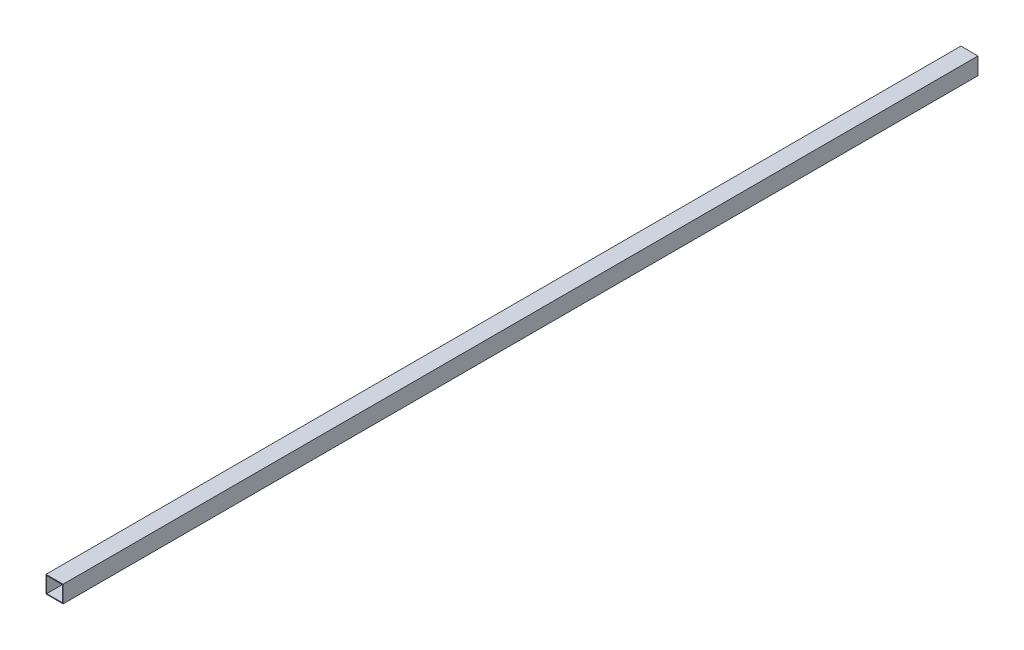
ISO-10303-21;
HEADER;
FILE_DESCRIPTION(('STEP AP214'),'2;1');
FILE_NAME('part.step','',(''),(''),'','','');
FILE_SCHEMA(('AUTOMOTIVE_DESIGN { 1 0 10303 214 1 1 1 1 }'));
ENDSEC;
DATA;
#1=APPLICATION_CONTEXT('core data for automotive mechanical design processes');
#2=APPLICATION_PROTOCOL_DEFINITION('international standard','automotive_design',2000,#1);
#3=PRODUCT_CONTEXT('',#1,'mechanical');
#4=PRODUCT('Part','Part','',(#3));
#5=PRODUCT_RELATED_PRODUCT_CATEGORY('part','',(#4));
#6=PRODUCT_DEFINITION_FORMATION('','',#4);
#7=PRODUCT_DEFINITION_CONTEXT('part definition',#1,'design');
#8=PRODUCT_DEFINITION('design','',#6,#7);
#9=PRODUCT_DEFINITION_SHAPE('','',#8);
#10=(LENGTH_UNIT() NAMED_UNIT(*) SI_UNIT(.MILLI.,.METRE.));
#11=(NAMED_UNIT(*) PLANE_ANGLE_UNIT() SI_UNIT($,.RADIAN.));
#12=(NAMED_UNIT(*) SI_UNIT($,.STERADIAN.) SOLID_ANGLE_UNIT());
#13=UNCERTAINTY_MEASURE_WITH_UNIT(LENGTH_MEASURE(1.E-05),#10,'distance_accuracy_value','');
#14=(GEOMETRIC_REPRESENTATION_CONTEXT(3) GLOBAL_UNCERTAINTY_ASSIGNED_CONTEXT((#13)) GLOBAL_UNIT_ASSIGNED_CONTEXT((#10,
#11,#12)) REPRESENTATION_CONTEXT('',''));
#15=CARTESIAN_POINT('',(0.,0.,0.));
#16=DIRECTION('',(0.,0.,1.));
#17=DIRECTION('',(1.,0.,0.));
#18=AXIS2_PLACEMENT_3D('',#15,#16,#17);
#19=CARTESIAN_POINT('',(0.,0.,2038.35));
#20=DIRECTION('',(0.,0.,-1.));
#21=DIRECTION('',(-1.,0.,0.));
#22=AXIS2_PLACEMENT_3D('',#19,#20,#21);
#23=PLANE('',#22);
#24=DIRECTION('',(0.,-1.,0.));
#25=VECTOR('',#24,1.);
#26=CARTESIAN_POINT('',(0.,0.,2038.35));
#27=LINE('',#26,#25);
#28=CARTESIAN_POINT('',(0.,38.1,2038.35));
#29=VERTEX_POINT('',#28);
#30=CARTESIAN_POINT('',(0.,0.,2038.35));
#31=VERTEX_POINT('',#30);
#32=EDGE_CURVE('E134',#29,#31,#27,.T.);
#33=ORIENTED_EDGE('',*,*,#32,.T.);
#34=DIRECTION('',(1.,0.,0.));
#35=VECTOR('',#34,1.);
#36=CARTESIAN_POINT('',(0.,0.,2038.35));
#37=LINE('',#36,#35);
#38=CARTESIAN_POINT('',(38.1,0.,2038.35));
#39=VERTEX_POINT('',#38);
#40=EDGE_CURVE('E137',#31,#39,#37,.T.);
#41=ORIENTED_EDGE('',*,*,#40,.T.);
#42=DIRECTION('',(0.,1.,0.));
#43=VECTOR('',#42,1.);
#44=CARTESIAN_POINT('',(38.1,0.,2038.35));
#45=LINE('',#44,#43);
#46=CARTESIAN_POINT('',(38.1,38.1,2038.35));
#47=VERTEX_POINT('',#46);
#48=EDGE_CURVE('E140',#39,#47,#45,.T.);
#49=ORIENTED_EDGE('',*,*,#48,.T.);
#50=DIRECTION('',(-1.,0.,0.));
#51=VECTOR('',#50,1.);
#52=CARTESIAN_POINT('',(0.,38.1,2038.35));
#53=LINE('',#52,#51);
#54=EDGE_CURVE('E142',#47,#29,#53,.T.);
#55=ORIENTED_EDGE('',*,*,#54,.T.);
#56=EDGE_LOOP('',(#33,#41,#49,#55));
#57=FACE_BOUND('',#56,.T.);
#58=DIRECTION('',(0.,-1.,0.));
#59=VECTOR('',#58,1.);
#60=CARTESIAN_POINT('',(1.5875,1.5875,2038.35));
#61=LINE('',#60,#59);
#62=CARTESIAN_POINT('',(1.5875,36.5125,2038.35));
#63=VERTEX_POINT('',#62);
#64=CARTESIAN_POINT('',(1.5875,1.5875,2038.35));
#65=VERTEX_POINT('',#64);
#66=EDGE_CURVE('E98',#63,#65,#61,.T.);
#67=ORIENTED_EDGE('',*,*,#66,.F.);
#68=DIRECTION('',(-1.,0.,0.));
#69=VECTOR('',#68,1.);
#70=CARTESIAN_POINT('',(1.5875,36.5125,2038.35));
#71=LINE('',#70,#69);
#72=CARTESIAN_POINT('',(36.5125,36.5125,2038.35));
#73=VERTEX_POINT('',#72);
#74=EDGE_CURVE('E120',#73,#63,#71,.T.);
#75=ORIENTED_EDGE('',*,*,#74,.F.);
#76=DIRECTION('',(0.,1.,0.));
#77=VECTOR('',#76,1.);
#78=CARTESIAN_POINT('',(36.5125,1.5875,2038.35));
#79=LINE('',#78,#77);
#80=CARTESIAN_POINT('',(36.5125,1.5875,2038.35));
#81=VERTEX_POINT('',#80);
#82=EDGE_CURVE('E118',#81,#73,#79,.T.);
#83=ORIENTED_EDGE('',*,*,#82,.F.);
#84=DIRECTION('',(1.,0.,0.));
#85=VECTOR('',#84,1.);
#86=CARTESIAN_POINT('',(1.5875,1.5875,2038.35));
#87=LINE('',#86,#85);
#88=EDGE_CURVE('E106',#65,#81,#87,.T.);
#89=ORIENTED_EDGE('',*,*,#88,.F.);
#90=EDGE_LOOP('',(#67,#75,#83,#89));
#91=FACE_BOUND('',#90,.T.);
#92=ADVANCED_FACE('F33',(#57,#91),#23,.F.);
#93=CARTESIAN_POINT('',(0.,0.,0.));
#94=DIRECTION('',(0.,0.,-1.));
#95=DIRECTION('',(-1.,0.,0.));
#96=AXIS2_PLACEMENT_3D('',#93,#94,#95);
#97=PLANE('',#96);
#98=DIRECTION('',(0.,-1.,0.));
#99=VECTOR('',#98,1.);
#100=CARTESIAN_POINT('',(0.,0.,0.));
#101=LINE('',#100,#99);
#102=CARTESIAN_POINT('',(0.,38.1,0.));
#103=VERTEX_POINT('',#102);
#104=CARTESIAN_POINT('',(0.,0.,0.));
#105=VERTEX_POINT('',#104);
#106=EDGE_CURVE('E114',#103,#105,#101,.T.);
#107=ORIENTED_EDGE('',*,*,#106,.F.);
#108=DIRECTION('',(-1.,0.,0.));
#109=VECTOR('',#108,1.);
#110=CARTESIAN_POINT('',(0.,38.1,0.));
#111=LINE('',#110,#109);
#112=CARTESIAN_POINT('',(38.1,38.1,0.));
#113=VERTEX_POINT('',#112);
#114=EDGE_CURVE('E138',#113,#103,#111,.T.);
#115=ORIENTED_EDGE('',*,*,#114,.F.);
#116=DIRECTION('',(0.,1.,0.));
#117=VECTOR('',#116,1.);
#118=CARTESIAN_POINT('',(38.1,0.,0.));
#119=LINE('',#118,#117);
#120=CARTESIAN_POINT('',(38.1,0.,0.));
#121=VERTEX_POINT('',#120);
#122=EDGE_CURVE('E149',#121,#113,#119,.T.);
#123=ORIENTED_EDGE('',*,*,#122,.F.);
#124=DIRECTION('',(1.,0.,0.));
#125=VECTOR('',#124,1.);
#126=CARTESIAN_POINT('',(0.,0.,0.));
#127=LINE('',#126,#125);
#128=EDGE_CURVE('E147',#105,#121,#127,.T.);
#129=ORIENTED_EDGE('',*,*,#128,.F.);
#130=EDGE_LOOP('',(#107,#115,#123,#129));
#131=FACE_BOUND('',#130,.T.);
#132=DIRECTION('',(-1.,0.,0.));
#133=VECTOR('',#132,1.);
#134=CARTESIAN_POINT('',(1.5875,36.5125,0.));
#135=LINE('',#134,#133);
#136=CARTESIAN_POINT('',(36.5125,36.5125,0.));
#137=VERTEX_POINT('',#136);
#138=CARTESIAN_POINT('',(1.5875,36.5125,0.));
#139=VERTEX_POINT('',#138);
#140=EDGE_CURVE('E107',#137,#139,#135,.T.);
#141=ORIENTED_EDGE('',*,*,#140,.T.);
#142=DIRECTION('',(0.,-1.,0.));
#143=VECTOR('',#142,1.);
#144=CARTESIAN_POINT('',(1.5875,1.5875,0.));
#145=LINE('',#144,#143);
#146=CARTESIAN_POINT('',(1.5875,1.5875,0.));
#147=VERTEX_POINT('',#146);
#148=EDGE_CURVE('E56',#139,#147,#145,.T.);
#149=ORIENTED_EDGE('',*,*,#148,.T.);
#150=DIRECTION('',(1.,0.,0.));
#151=VECTOR('',#150,1.);
#152=CARTESIAN_POINT('',(1.5875,1.5875,0.));
#153=LINE('',#152,#151);
#154=CARTESIAN_POINT('',(36.5125,1.5875,0.));
#155=VERTEX_POINT('',#154);
#156=EDGE_CURVE('E113',#147,#155,#153,.T.);
#157=ORIENTED_EDGE('',*,*,#156,.T.);
#158=DIRECTION('',(0.,1.,0.));
#159=VECTOR('',#158,1.);
#160=CARTESIAN_POINT('',(36.5125,1.5875,0.));
#161=LINE('',#160,#159);
#162=EDGE_CURVE('E126',#155,#137,#161,.T.);
#163=ORIENTED_EDGE('',*,*,#162,.T.);
#164=EDGE_LOOP('',(#141,#149,#157,#163));
#165=FACE_BOUND('',#164,.T.);
#166=ADVANCED_FACE('F167',(#131,#165),#97,.T.);
#167=CARTESIAN_POINT('',(0.,0.,2038.35));
#168=DIRECTION('',(1.,0.,0.));
#169=DIRECTION('',(0.,0.,-1.));
#170=AXIS2_PLACEMENT_3D('',#167,#168,#169);
#171=PLANE('',#170);
#172=ORIENTED_EDGE('',*,*,#106,.T.);
#173=DIRECTION('',(0.,0.,-1.));
#174=VECTOR('',#173,1.);
#175=CARTESIAN_POINT('',(0.,0.,2038.35));
#176=LINE('',#175,#174);
#177=EDGE_CURVE('E11',#31,#105,#176,.T.);
#178=ORIENTED_EDGE('',*,*,#177,.F.);
#179=ORIENTED_EDGE('',*,*,#32,.F.);
#180=DIRECTION('',(0.,0.,-1.));
#181=VECTOR('',#180,1.);
#182=CARTESIAN_POINT('',(0.,38.1,2038.35));
#183=LINE('',#182,#181);
#184=EDGE_CURVE('E144',#29,#103,#183,.T.);
#185=ORIENTED_EDGE('',*,*,#184,.T.);
#186=EDGE_LOOP('',(#172,#178,#179,#185));
#187=FACE_BOUND('',#186,.T.);
#188=ADVANCED_FACE('F35',(#187),#171,.F.);
#189=CARTESIAN_POINT('',(0.,0.,2038.35));
#190=DIRECTION('',(0.,1.,0.));
#191=DIRECTION('',(0.,0.,1.));
#192=AXIS2_PLACEMENT_3D('',#189,#190,#191);
#193=PLANE('',#192);
#194=ORIENTED_EDGE('',*,*,#128,.T.);
#195=DIRECTION('',(0.,0.,-1.));
#196=VECTOR('',#195,1.);
#197=CARTESIAN_POINT('',(38.1,0.,2038.35));
#198=LINE('',#197,#196);
#199=EDGE_CURVE('E41',#39,#121,#198,.T.);
#200=ORIENTED_EDGE('',*,*,#199,.F.);
#201=ORIENTED_EDGE('',*,*,#40,.F.);
#202=ORIENTED_EDGE('',*,*,#177,.T.);
#203=EDGE_LOOP('',(#194,#200,#201,#202));
#204=FACE_BOUND('',#203,.T.);
#205=ADVANCED_FACE('F177',(#204),#193,.F.);
#206=CARTESIAN_POINT('',(38.1,0.,2038.35));
#207=DIRECTION('',(-1.,0.,0.));
#208=DIRECTION('',(0.,0.,1.));
#209=AXIS2_PLACEMENT_3D('',#206,#207,#208);
#210=PLANE('',#209);
#211=ORIENTED_EDGE('',*,*,#122,.T.);
#212=DIRECTION('',(0.,0.,-1.));
#213=VECTOR('',#212,1.);
#214=CARTESIAN_POINT('',(38.1,38.1,2038.35));
#215=LINE('',#214,#213);
#216=EDGE_CURVE('E154',#47,#113,#215,.T.);
#217=ORIENTED_EDGE('',*,*,#216,.F.);
#218=ORIENTED_EDGE('',*,*,#48,.F.);
#219=ORIENTED_EDGE('',*,*,#199,.T.);
#220=EDGE_LOOP('',(#211,#217,#218,#219));
#221=FACE_BOUND('',#220,.T.);
#222=ADVANCED_FACE('F161',(#221),#210,.F.);
#223=CARTESIAN_POINT('',(0.,38.1,2038.35));
#224=DIRECTION('',(0.,-1.,0.));
#225=DIRECTION('',(0.,0.,-1.));
#226=AXIS2_PLACEMENT_3D('',#223,#224,#225);
#227=PLANE('',#226);
#228=ORIENTED_EDGE('',*,*,#114,.T.);
#229=ORIENTED_EDGE('',*,*,#184,.F.);
#230=ORIENTED_EDGE('',*,*,#54,.F.);
#231=ORIENTED_EDGE('',*,*,#216,.T.);
#232=EDGE_LOOP('',(#228,#229,#230,#231));
#233=FACE_BOUND('',#232,.T.);
#234=ADVANCED_FACE('F171',(#233),#227,.F.);
#235=CARTESIAN_POINT('',(1.5875,1.5875,2038.35));
#236=DIRECTION('',(1.,0.,0.));
#237=DIRECTION('',(0.,1.,0.));
#238=AXIS2_PLACEMENT_3D('',#235,#236,#237);
#239=PLANE('',#238);
#240=ORIENTED_EDGE('',*,*,#148,.F.);
#241=DIRECTION('',(0.,0.,-1.));
#242=VECTOR('',#241,1.);
#243=CARTESIAN_POINT('',(1.5875,36.5125,2038.35));
#244=LINE('',#243,#242);
#245=EDGE_CURVE('E102',#63,#139,#244,.T.);
#246=ORIENTED_EDGE('',*,*,#245,.F.);
#247=ORIENTED_EDGE('',*,*,#66,.T.);
#248=DIRECTION('',(0.,0.,-1.));
#249=VECTOR('',#248,1.);
#250=CARTESIAN_POINT('',(1.5875,1.5875,2038.35));
#251=LINE('',#250,#249);
#252=EDGE_CURVE('E101',#65,#147,#251,.T.);
#253=ORIENTED_EDGE('',*,*,#252,.T.);
#254=EDGE_LOOP('',(#240,#246,#247,#253));
#255=FACE_BOUND('',#254,.T.);
#256=ADVANCED_FACE('F100',(#255),#239,.T.);
#257=CARTESIAN_POINT('',(1.5875,1.5875,2038.35));
#258=DIRECTION('',(0.,1.,0.));
#259=DIRECTION('',(0.,0.,1.));
#260=AXIS2_PLACEMENT_3D('',#257,#258,#259);
#261=PLANE('',#260);
#262=ORIENTED_EDGE('',*,*,#156,.F.);
#263=ORIENTED_EDGE('',*,*,#252,.F.);
#264=ORIENTED_EDGE('',*,*,#88,.T.);
#265=DIRECTION('',(0.,0.,-1.));
#266=VECTOR('',#265,1.);
#267=CARTESIAN_POINT('',(36.5125,1.5875,2038.35));
#268=LINE('',#267,#266);
#269=EDGE_CURVE('E115',#81,#155,#268,.T.);
#270=ORIENTED_EDGE('',*,*,#269,.T.);
#271=EDGE_LOOP('',(#262,#263,#264,#270));
#272=FACE_BOUND('',#271,.T.);
#273=ADVANCED_FACE('F110',(#272),#261,.T.);
#274=CARTESIAN_POINT('',(36.5125,1.5875,2038.35));
#275=DIRECTION('',(-1.,0.,0.));
#276=DIRECTION('',(0.,0.,1.));
#277=AXIS2_PLACEMENT_3D('',#274,#275,#276);
#278=PLANE('',#277);
#279=ORIENTED_EDGE('',*,*,#162,.F.);
#280=ORIENTED_EDGE('',*,*,#269,.F.);
#281=ORIENTED_EDGE('',*,*,#82,.T.);
#282=DIRECTION('',(0.,0.,-1.));
#283=VECTOR('',#282,1.);
#284=CARTESIAN_POINT('',(36.5125,36.5125,2038.35));
#285=LINE('',#284,#283);
#286=EDGE_CURVE('E48',#73,#137,#285,.T.);
#287=ORIENTED_EDGE('',*,*,#286,.T.);
#288=EDGE_LOOP('',(#279,#280,#281,#287));
#289=FACE_BOUND('',#288,.T.);
#290=ADVANCED_FACE('F200',(#289),#278,.T.);
#291=CARTESIAN_POINT('',(1.5875,36.5125,2038.35));
#292=DIRECTION('',(0.,-1.,0.));
#293=DIRECTION('',(0.,0.,-1.));
#294=AXIS2_PLACEMENT_3D('',#291,#292,#293);
#295=PLANE('',#294);
#296=ORIENTED_EDGE('',*,*,#140,.F.);
#297=ORIENTED_EDGE('',*,*,#286,.F.);
#298=ORIENTED_EDGE('',*,*,#74,.T.);
#299=ORIENTED_EDGE('',*,*,#245,.T.);
#300=EDGE_LOOP('',(#296,#297,#298,#299));
#301=FACE_BOUND('',#300,.T.);
#302=ADVANCED_FACE('F204',(#301),#295,.T.);
#303=CLOSED_SHELL('',(#92,#166,#188,#205,#222,#234,#256,#273,#290,#302));
#304=MANIFOLD_SOLID_BREP('B2',#303);
#305=ADVANCED_BREP_SHAPE_REPRESENTATION('',(#18,#304),#14);
#306=SHAPE_DEFINITION_REPRESENTATION(#9,#305);
ENDSEC;
END-ISO-10303-21;
